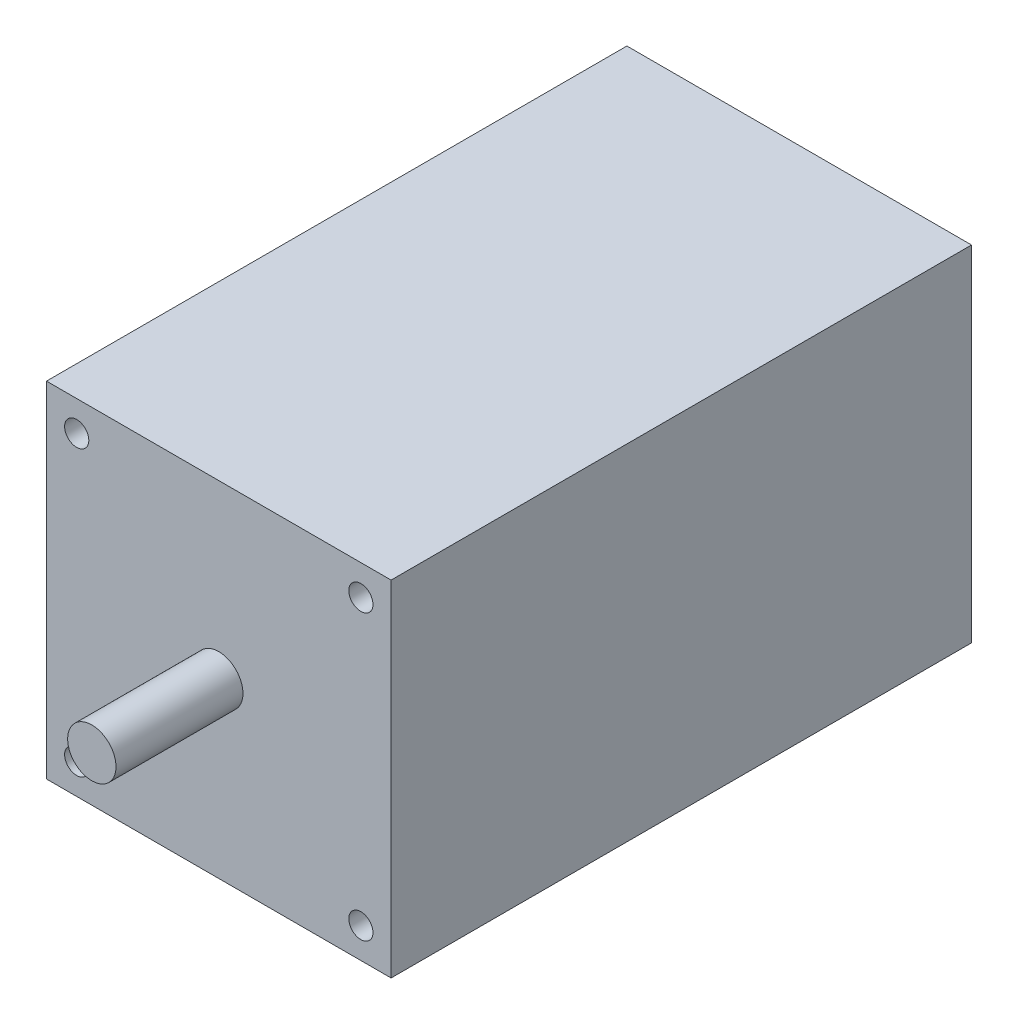
ISO-10303-21;
HEADER;
FILE_DESCRIPTION(('STEP AP214'),'2;1');
FILE_NAME('part.step','',(''),(''),'','','');
FILE_SCHEMA(('AUTOMOTIVE_DESIGN { 1 0 10303 214 1 1 1 1 }'));
ENDSEC;
DATA;
#1=APPLICATION_CONTEXT('core data for automotive mechanical design processes');
#2=APPLICATION_PROTOCOL_DEFINITION('international standard','automotive_design',2000,#1);
#3=PRODUCT_CONTEXT('',#1,'mechanical');
#4=PRODUCT('Part','Part','',(#3));
#5=PRODUCT_RELATED_PRODUCT_CATEGORY('part','',(#4));
#6=PRODUCT_DEFINITION_FORMATION('','',#4);
#7=PRODUCT_DEFINITION_CONTEXT('part definition',#1,'design');
#8=PRODUCT_DEFINITION('design','',#6,#7);
#9=PRODUCT_DEFINITION_SHAPE('','',#8);
#10=(LENGTH_UNIT() NAMED_UNIT(*) SI_UNIT(.MILLI.,.METRE.));
#11=(NAMED_UNIT(*) PLANE_ANGLE_UNIT() SI_UNIT($,.RADIAN.));
#12=(NAMED_UNIT(*) SI_UNIT($,.STERADIAN.) SOLID_ANGLE_UNIT());
#13=UNCERTAINTY_MEASURE_WITH_UNIT(LENGTH_MEASURE(1.E-05),#10,'distance_accuracy_value','');
#14=(GEOMETRIC_REPRESENTATION_CONTEXT(3) GLOBAL_UNCERTAINTY_ASSIGNED_CONTEXT((#13)) GLOBAL_UNIT_ASSIGNED_CONTEXT((#10,
#11,#12)) REPRESENTATION_CONTEXT('',''));
#15=CARTESIAN_POINT('',(0.,0.,0.));
#16=DIRECTION('',(0.,0.,1.));
#17=DIRECTION('',(1.,0.,0.));
#18=AXIS2_PLACEMENT_3D('',#15,#16,#17);
#19=CARTESIAN_POINT('',(-28.5,28.5,-96.));
#20=DIRECTION('',(-1.,0.,0.));
#21=DIRECTION('',(0.,0.,1.));
#22=AXIS2_PLACEMENT_3D('',#19,#20,#21);
#23=PLANE('',#22);
#24=DIRECTION('',(0.,-1.,0.));
#25=VECTOR('',#24,1.);
#26=CARTESIAN_POINT('',(-28.5,28.5,0.));
#27=LINE('',#26,#25);
#28=CARTESIAN_POINT('',(-28.5,28.5,0.));
#29=VERTEX_POINT('',#28);
#30=CARTESIAN_POINT('',(-28.5,-28.5,0.));
#31=VERTEX_POINT('',#30);
#32=EDGE_CURVE('E101',#29,#31,#27,.T.);
#33=ORIENTED_EDGE('',*,*,#32,.F.);
#34=DIRECTION('',(0.,0.,1.));
#35=VECTOR('',#34,1.);
#36=CARTESIAN_POINT('',(-28.5,28.5,-96.));
#37=LINE('',#36,#35);
#38=CARTESIAN_POINT('',(-28.5,28.5,-96.));
#39=VERTEX_POINT('',#38);
#40=EDGE_CURVE('E42',#39,#29,#37,.T.);
#41=ORIENTED_EDGE('',*,*,#40,.F.);
#42=DIRECTION('',(0.,-1.,0.));
#43=VECTOR('',#42,1.);
#44=CARTESIAN_POINT('',(-28.5,28.5,-96.));
#45=LINE('',#44,#43);
#46=CARTESIAN_POINT('',(-28.5,-28.5,-96.));
#47=VERTEX_POINT('',#46);
#48=EDGE_CURVE('E94',#39,#47,#45,.T.);
#49=ORIENTED_EDGE('',*,*,#48,.T.);
#50=DIRECTION('',(0.,0.,1.));
#51=VECTOR('',#50,1.);
#52=CARTESIAN_POINT('',(-28.5,-28.5,-96.));
#53=LINE('',#52,#51);
#54=EDGE_CURVE('E77',#47,#31,#53,.T.);
#55=ORIENTED_EDGE('',*,*,#54,.T.);
#56=EDGE_LOOP('',(#33,#41,#49,#55));
#57=FACE_BOUND('',#56,.T.);
#58=ADVANCED_FACE('F34',(#57),#23,.T.);
#59=CARTESIAN_POINT('',(28.5,28.5,-96.));
#60=DIRECTION('',(0.,1.,0.));
#61=DIRECTION('',(0.,0.,1.));
#62=AXIS2_PLACEMENT_3D('',#59,#60,#61);
#63=PLANE('',#62);
#64=DIRECTION('',(-1.,0.,0.));
#65=VECTOR('',#64,1.);
#66=CARTESIAN_POINT('',(28.5,28.5,0.));
#67=LINE('',#66,#65);
#68=CARTESIAN_POINT('',(28.5,28.5,0.));
#69=VERTEX_POINT('',#68);
#70=EDGE_CURVE('E96',#69,#29,#67,.T.);
#71=ORIENTED_EDGE('',*,*,#70,.F.);
#72=DIRECTION('',(0.,0.,1.));
#73=VECTOR('',#72,1.);
#74=CARTESIAN_POINT('',(28.5,28.5,-96.));
#75=LINE('',#74,#73);
#76=CARTESIAN_POINT('',(28.5,28.5,-96.));
#77=VERTEX_POINT('',#76);
#78=EDGE_CURVE('E66',#77,#69,#75,.T.);
#79=ORIENTED_EDGE('',*,*,#78,.F.);
#80=DIRECTION('',(-1.,0.,0.));
#81=VECTOR('',#80,1.);
#82=CARTESIAN_POINT('',(28.5,28.5,-96.));
#83=LINE('',#82,#81);
#84=EDGE_CURVE('E91',#77,#39,#83,.T.);
#85=ORIENTED_EDGE('',*,*,#84,.T.);
#86=ORIENTED_EDGE('',*,*,#40,.T.);
#87=EDGE_LOOP('',(#71,#79,#85,#86));
#88=FACE_BOUND('',#87,.T.);
#89=ADVANCED_FACE('F113',(#88),#63,.T.);
#90=CARTESIAN_POINT('',(28.5,28.5,-96.));
#91=DIRECTION('',(1.,0.,0.));
#92=DIRECTION('',(0.,0.,-1.));
#93=AXIS2_PLACEMENT_3D('',#90,#91,#92);
#94=PLANE('',#93);
#95=DIRECTION('',(0.,1.,0.));
#96=VECTOR('',#95,1.);
#97=CARTESIAN_POINT('',(28.5,28.5,0.));
#98=LINE('',#97,#96);
#99=CARTESIAN_POINT('',(28.5,-28.5,0.));
#100=VERTEX_POINT('',#99);
#101=EDGE_CURVE('E85',#100,#69,#98,.T.);
#102=ORIENTED_EDGE('',*,*,#101,.F.);
#103=DIRECTION('',(0.,0.,1.));
#104=VECTOR('',#103,1.);
#105=CARTESIAN_POINT('',(28.5,-28.5,-96.));
#106=LINE('',#105,#104);
#107=CARTESIAN_POINT('',(28.5,-28.5,-96.));
#108=VERTEX_POINT('',#107);
#109=EDGE_CURVE('E80',#108,#100,#106,.T.);
#110=ORIENTED_EDGE('',*,*,#109,.F.);
#111=DIRECTION('',(0.,1.,0.));
#112=VECTOR('',#111,1.);
#113=CARTESIAN_POINT('',(28.5,28.5,-96.));
#114=LINE('',#113,#112);
#115=EDGE_CURVE('E83',#108,#77,#114,.T.);
#116=ORIENTED_EDGE('',*,*,#115,.T.);
#117=ORIENTED_EDGE('',*,*,#78,.T.);
#118=EDGE_LOOP('',(#102,#110,#116,#117));
#119=FACE_BOUND('',#118,.T.);
#120=ADVANCED_FACE('F82',(#119),#94,.T.);
#121=CARTESIAN_POINT('',(28.5,-28.5,-96.));
#122=DIRECTION('',(0.,-1.,0.));
#123=DIRECTION('',(0.,0.,-1.));
#124=AXIS2_PLACEMENT_3D('',#121,#122,#123);
#125=PLANE('',#124);
#126=DIRECTION('',(1.,0.,0.));
#127=VECTOR('',#126,1.);
#128=CARTESIAN_POINT('',(28.5,-28.5,0.));
#129=LINE('',#128,#127);
#130=EDGE_CURVE('E104',#31,#100,#129,.T.);
#131=ORIENTED_EDGE('',*,*,#130,.F.);
#132=ORIENTED_EDGE('',*,*,#54,.F.);
#133=DIRECTION('',(1.,0.,0.));
#134=VECTOR('',#133,1.);
#135=CARTESIAN_POINT('',(28.5,-28.5,-96.));
#136=LINE('',#135,#134);
#137=EDGE_CURVE('E90',#47,#108,#136,.T.);
#138=ORIENTED_EDGE('',*,*,#137,.T.);
#139=ORIENTED_EDGE('',*,*,#109,.T.);
#140=EDGE_LOOP('',(#131,#132,#138,#139));
#141=FACE_BOUND('',#140,.T.);
#142=ADVANCED_FACE('F93',(#141),#125,.T.);
#143=CARTESIAN_POINT('',(0.,0.,-96.));
#144=DIRECTION('',(0.,0.,-1.));
#145=DIRECTION('',(-1.,0.,0.));
#146=AXIS2_PLACEMENT_3D('',#143,#144,#145);
#147=PLANE('',#146);
#148=CARTESIAN_POINT('',(-23.5,-23.5,-96.));
#149=DIRECTION('',(0.,0.,1.));
#150=DIRECTION('',(-1.,0.,0.));
#151=AXIS2_PLACEMENT_3D('',#148,#149,#150);
#152=CIRCLE('',#151,2.);
#153=CARTESIAN_POINT('',(-25.5,-23.5,-96.));
#154=VERTEX_POINT('',#153);
#155=EDGE_CURVE('E166',#154,#154,#152,.T.);
#156=ORIENTED_EDGE('',*,*,#155,.T.);
#157=EDGE_LOOP('',(#156));
#158=FACE_BOUND('',#157,.T.);
#159=CARTESIAN_POINT('',(23.5,-23.5,-96.));
#160=DIRECTION('',(0.,0.,1.));
#161=DIRECTION('',(-1.,0.,0.));
#162=AXIS2_PLACEMENT_3D('',#159,#160,#161);
#163=CIRCLE('',#162,2.);
#164=CARTESIAN_POINT('',(21.5,-23.5,-96.));
#165=VERTEX_POINT('',#164);
#166=EDGE_CURVE('E171',#165,#165,#163,.T.);
#167=ORIENTED_EDGE('',*,*,#166,.T.);
#168=EDGE_LOOP('',(#167));
#169=FACE_BOUND('',#168,.T.);
#170=CARTESIAN_POINT('',(23.5,23.5,-96.));
#171=DIRECTION('',(0.,0.,1.));
#172=DIRECTION('',(1.,0.,0.));
#173=AXIS2_PLACEMENT_3D('',#170,#171,#172);
#174=CIRCLE('',#173,2.);
#175=CARTESIAN_POINT('',(25.5,23.5,-96.));
#176=VERTEX_POINT('',#175);
#177=EDGE_CURVE('E177',#176,#176,#174,.T.);
#178=ORIENTED_EDGE('',*,*,#177,.T.);
#179=EDGE_LOOP('',(#178));
#180=FACE_BOUND('',#179,.T.);
#181=CARTESIAN_POINT('',(-23.5,23.5,-96.));
#182=DIRECTION('',(0.,0.,1.));
#183=DIRECTION('',(1.,0.,0.));
#184=AXIS2_PLACEMENT_3D('',#181,#182,#183);
#185=CIRCLE('',#184,2.);
#186=CARTESIAN_POINT('',(-21.5,23.5,-96.));
#187=VERTEX_POINT('',#186);
#188=EDGE_CURVE('E105',#187,#187,#185,.T.);
#189=ORIENTED_EDGE('',*,*,#188,.T.);
#190=EDGE_LOOP('',(#189));
#191=FACE_BOUND('',#190,.T.);
#192=ORIENTED_EDGE('',*,*,#48,.F.);
#193=ORIENTED_EDGE('',*,*,#84,.F.);
#194=ORIENTED_EDGE('',*,*,#115,.F.);
#195=ORIENTED_EDGE('',*,*,#137,.F.);
#196=EDGE_LOOP('',(#192,#193,#194,#195));
#197=FACE_BOUND('',#196,.T.);
#198=ADVANCED_FACE('F89',(#158,#169,#180,#191,#197),#147,.T.);
#199=CARTESIAN_POINT('',(0.,0.,0.));
#200=DIRECTION('',(0.,0.,-1.));
#201=DIRECTION('',(-1.,0.,0.));
#202=AXIS2_PLACEMENT_3D('',#199,#200,#201);
#203=PLANE('',#202);
#204=CARTESIAN_POINT('',(0.,0.,0.));
#205=DIRECTION('',(0.,0.,-1.));
#206=DIRECTION('',(-1.,0.,0.));
#207=AXIS2_PLACEMENT_3D('',#204,#205,#206);
#208=CIRCLE('',#207,4.);
#209=CARTESIAN_POINT('',(-4.,0.,0.));
#210=VERTEX_POINT('',#209);
#211=EDGE_CURVE('E11',#210,#210,#208,.F.);
#212=ORIENTED_EDGE('',*,*,#211,.F.);
#213=EDGE_LOOP('',(#212));
#214=FACE_BOUND('',#213,.T.);
#215=CARTESIAN_POINT('',(-23.5,-23.5,0.));
#216=DIRECTION('',(0.,0.,1.));
#217=DIRECTION('',(-1.,0.,0.));
#218=AXIS2_PLACEMENT_3D('',#215,#216,#217);
#219=CIRCLE('',#218,2.);
#220=CARTESIAN_POINT('',(-25.5,-23.5,0.));
#221=VERTEX_POINT('',#220);
#222=EDGE_CURVE('E163',#221,#221,#219,.T.);
#223=ORIENTED_EDGE('',*,*,#222,.F.);
#224=EDGE_LOOP('',(#223));
#225=FACE_BOUND('',#224,.T.);
#226=CARTESIAN_POINT('',(23.5,-23.5,0.));
#227=DIRECTION('',(0.,0.,1.));
#228=DIRECTION('',(-1.,0.,0.));
#229=AXIS2_PLACEMENT_3D('',#226,#227,#228);
#230=CIRCLE('',#229,2.);
#231=CARTESIAN_POINT('',(21.5,-23.5,0.));
#232=VERTEX_POINT('',#231);
#233=EDGE_CURVE('E169',#232,#232,#230,.T.);
#234=ORIENTED_EDGE('',*,*,#233,.F.);
#235=EDGE_LOOP('',(#234));
#236=FACE_BOUND('',#235,.T.);
#237=CARTESIAN_POINT('',(23.5,23.5,0.));
#238=DIRECTION('',(0.,0.,1.));
#239=DIRECTION('',(1.,0.,0.));
#240=AXIS2_PLACEMENT_3D('',#237,#238,#239);
#241=CIRCLE('',#240,2.);
#242=CARTESIAN_POINT('',(25.5,23.5,0.));
#243=VERTEX_POINT('',#242);
#244=EDGE_CURVE('E174',#243,#243,#241,.T.);
#245=ORIENTED_EDGE('',*,*,#244,.F.);
#246=EDGE_LOOP('',(#245));
#247=FACE_BOUND('',#246,.T.);
#248=CARTESIAN_POINT('',(-23.5,23.5,0.));
#249=DIRECTION('',(0.,0.,1.));
#250=DIRECTION('',(1.,0.,0.));
#251=AXIS2_PLACEMENT_3D('',#248,#249,#250);
#252=CIRCLE('',#251,2.);
#253=CARTESIAN_POINT('',(-21.5,23.5,0.));
#254=VERTEX_POINT('',#253);
#255=EDGE_CURVE('E180',#254,#254,#252,.T.);
#256=ORIENTED_EDGE('',*,*,#255,.F.);
#257=EDGE_LOOP('',(#256));
#258=FACE_BOUND('',#257,.T.);
#259=ORIENTED_EDGE('',*,*,#32,.T.);
#260=ORIENTED_EDGE('',*,*,#130,.T.);
#261=ORIENTED_EDGE('',*,*,#101,.T.);
#262=ORIENTED_EDGE('',*,*,#70,.T.);
#263=EDGE_LOOP('',(#259,#260,#261,#262));
#264=FACE_BOUND('',#263,.T.);
#265=ADVANCED_FACE('F112',(#214,#225,#236,#247,#258,#264),#203,.F.);
#266=CARTESIAN_POINT('',(-23.5,23.5,-96.));
#267=DIRECTION('',(0.,0.,1.));
#268=DIRECTION('',(1.,0.,0.));
#269=AXIS2_PLACEMENT_3D('',#266,#267,#268);
#270=CYLINDRICAL_SURFACE('',#269,2.);
#271=ORIENTED_EDGE('',*,*,#188,.F.);
#272=EDGE_LOOP('',(#271));
#273=FACE_BOUND('',#272,.T.);
#274=ORIENTED_EDGE('',*,*,#255,.T.);
#275=EDGE_LOOP('',(#274));
#276=FACE_BOUND('',#275,.T.);
#277=ADVANCED_FACE('F131',(#273,#276),#270,.F.);
#278=CARTESIAN_POINT('',(23.5,23.5,-96.));
#279=DIRECTION('',(0.,0.,1.));
#280=DIRECTION('',(1.,0.,0.));
#281=AXIS2_PLACEMENT_3D('',#278,#279,#280);
#282=CYLINDRICAL_SURFACE('',#281,2.);
#283=ORIENTED_EDGE('',*,*,#177,.F.);
#284=EDGE_LOOP('',(#283));
#285=FACE_BOUND('',#284,.T.);
#286=ORIENTED_EDGE('',*,*,#244,.T.);
#287=EDGE_LOOP('',(#286));
#288=FACE_BOUND('',#287,.T.);
#289=ADVANCED_FACE('F138',(#285,#288),#282,.F.);
#290=CARTESIAN_POINT('',(23.5,-23.5,-96.));
#291=DIRECTION('',(0.,0.,1.));
#292=DIRECTION('',(1.,0.,0.));
#293=AXIS2_PLACEMENT_3D('',#290,#291,#292);
#294=CYLINDRICAL_SURFACE('',#293,2.);
#295=ORIENTED_EDGE('',*,*,#166,.F.);
#296=EDGE_LOOP('',(#295));
#297=FACE_BOUND('',#296,.T.);
#298=ORIENTED_EDGE('',*,*,#233,.T.);
#299=EDGE_LOOP('',(#298));
#300=FACE_BOUND('',#299,.T.);
#301=ADVANCED_FACE('F142',(#297,#300),#294,.F.);
#302=CARTESIAN_POINT('',(-23.5,-23.5,-96.));
#303=DIRECTION('',(0.,0.,1.));
#304=DIRECTION('',(1.,0.,0.));
#305=AXIS2_PLACEMENT_3D('',#302,#303,#304);
#306=CYLINDRICAL_SURFACE('',#305,2.);
#307=ORIENTED_EDGE('',*,*,#155,.F.);
#308=EDGE_LOOP('',(#307));
#309=FACE_BOUND('',#308,.T.);
#310=ORIENTED_EDGE('',*,*,#222,.T.);
#311=EDGE_LOOP('',(#310));
#312=FACE_BOUND('',#311,.T.);
#313=ADVANCED_FACE('F146',(#309,#312),#306,.F.);
#314=CARTESIAN_POINT('',(0.,0.,21.));
#315=DIRECTION('',(0.,0.,-1.));
#316=DIRECTION('',(-1.,0.,0.));
#317=AXIS2_PLACEMENT_3D('',#314,#315,#316);
#318=CYLINDRICAL_SURFACE('',#317,4.);
#319=CARTESIAN_POINT('',(0.,0.,21.));
#320=DIRECTION('',(0.,0.,1.));
#321=DIRECTION('',(1.,0.,0.));
#322=AXIS2_PLACEMENT_3D('',#319,#320,#321);
#323=CIRCLE('',#322,4.);
#324=CARTESIAN_POINT('',(-4.,0.,21.));
#325=VERTEX_POINT('',#324);
#326=EDGE_CURVE('E162',#325,#325,#323,.T.);
#327=CARTESIAN_POINT('',(-4.,0.,21.));
#328=CARTESIAN_POINT('',(-4.,0.,20.78125));
#329=CARTESIAN_POINT('',(-4.,0.,20.5625));
#330=CARTESIAN_POINT('',(-4.,0.,20.125));
#331=CARTESIAN_POINT('',(-4.,0.,19.90625));
#332=CARTESIAN_POINT('',(-4.,0.,19.46875));
#333=CARTESIAN_POINT('',(-4.,0.,19.25));
#334=CARTESIAN_POINT('',(-4.,0.,18.8125));
#335=CARTESIAN_POINT('',(-4.,0.,18.59375));
#336=CARTESIAN_POINT('',(-4.,0.,18.15625));
#337=CARTESIAN_POINT('',(-4.,0.,17.9375));
#338=CARTESIAN_POINT('',(-4.,0.,17.5));
#339=CARTESIAN_POINT('',(-4.,0.,17.28125));
#340=CARTESIAN_POINT('',(-4.,0.,16.84375));
#341=CARTESIAN_POINT('',(-4.,0.,16.625));
#342=CARTESIAN_POINT('',(-4.,0.,16.1875));
#343=CARTESIAN_POINT('',(-4.,0.,15.96875));
#344=CARTESIAN_POINT('',(-4.,0.,15.53125));
#345=CARTESIAN_POINT('',(-4.,0.,15.3125));
#346=CARTESIAN_POINT('',(-4.,0.,14.875));
#347=CARTESIAN_POINT('',(-4.,0.,14.65625));
#348=CARTESIAN_POINT('',(-4.,0.,14.21875));
#349=CARTESIAN_POINT('',(-4.,0.,14.));
#350=CARTESIAN_POINT('',(-4.,0.,13.5625));
#351=CARTESIAN_POINT('',(-4.,0.,13.34375));
#352=CARTESIAN_POINT('',(-4.,0.,12.90625));
#353=CARTESIAN_POINT('',(-4.,0.,12.6875));
#354=CARTESIAN_POINT('',(-4.,0.,12.25));
#355=CARTESIAN_POINT('',(-4.,0.,12.03125));
#356=CARTESIAN_POINT('',(-4.,0.,11.59375));
#357=CARTESIAN_POINT('',(-4.,0.,11.375));
#358=CARTESIAN_POINT('',(-4.,0.,10.9375));
#359=CARTESIAN_POINT('',(-4.,0.,10.71875));
#360=CARTESIAN_POINT('',(-4.,0.,10.28125));
#361=CARTESIAN_POINT('',(-4.,0.,10.0625));
#362=CARTESIAN_POINT('',(-4.,0.,9.625));
#363=CARTESIAN_POINT('',(-4.,0.,9.40625));
#364=CARTESIAN_POINT('',(-4.,0.,8.96875));
#365=CARTESIAN_POINT('',(-4.,0.,8.75));
#366=CARTESIAN_POINT('',(-4.,0.,8.3125));
#367=CARTESIAN_POINT('',(-4.,0.,8.09375));
#368=CARTESIAN_POINT('',(-4.,0.,7.65625));
#369=CARTESIAN_POINT('',(-4.,0.,7.4375));
#370=CARTESIAN_POINT('',(-4.,0.,7.));
#371=CARTESIAN_POINT('',(-4.,0.,6.78125));
#372=CARTESIAN_POINT('',(-4.,0.,6.34375));
#373=CARTESIAN_POINT('',(-4.,0.,6.125));
#374=CARTESIAN_POINT('',(-4.,0.,5.6875));
#375=CARTESIAN_POINT('',(-4.,0.,5.46875));
#376=CARTESIAN_POINT('',(-4.,0.,5.03125));
#377=CARTESIAN_POINT('',(-4.,0.,4.8125));
#378=CARTESIAN_POINT('',(-4.,0.,4.375));
#379=CARTESIAN_POINT('',(-4.,0.,4.15625));
#380=CARTESIAN_POINT('',(-4.,0.,3.71875));
#381=CARTESIAN_POINT('',(-4.,0.,3.5));
#382=CARTESIAN_POINT('',(-4.,0.,3.0625));
#383=CARTESIAN_POINT('',(-4.,0.,2.84375));
#384=CARTESIAN_POINT('',(-4.,0.,2.40625));
#385=CARTESIAN_POINT('',(-4.,0.,2.1875));
#386=CARTESIAN_POINT('',(-4.,0.,1.75));
#387=CARTESIAN_POINT('',(-4.,0.,1.53125));
#388=CARTESIAN_POINT('',(-4.,0.,1.09375));
#389=CARTESIAN_POINT('',(-4.,0.,0.875000000000001));
#390=CARTESIAN_POINT('',(-4.,0.,0.4375));
#391=CARTESIAN_POINT('',(-4.,0.,0.21875));
#392=CARTESIAN_POINT('',(-4.,0.,0.));
#393=B_SPLINE_CURVE_WITH_KNOTS('',3,(#327,#328,#329,#330,#331,#332,#333,#334,#335,#336,#337,
#338,#339,#340,#341,#342,#343,#344,#345,#346,#347,#348,#349,#350,#351,#352,#353,#354,#355,#356,
#357,#358,#359,#360,#361,#362,#363,#364,#365,#366,#367,#368,#369,#370,#371,#372,#373,#374,#375,
#376,#377,#378,#379,#380,#381,#382,#383,#384,#385,#386,#387,#388,#389,#390,#391,#392),
.UNSPECIFIED.,.F.,.F.,(4,2,2,2,2,2,2,2,2,2,2,2,2,2,2,2,2,2,2,2,2,2,2,2,2,2,2,2,2,2,2,2,4),(0.,
0.656249999999997,1.3125,1.96875,2.625,3.28125,3.9375,4.59375,5.25,5.90625,6.5625,7.21875,7.875,
8.53125,9.1875,9.84375,10.5,11.15625,11.8125,12.46875,13.125,13.78125,14.4375,15.09375,15.75,
16.40625,17.0625,17.71875,18.375,19.03125,19.6875,20.34375,21.),.UNSPECIFIED.);
#394=EDGE_CURVE('BSEAM150',#325,#210,#393,.T.);
#395=ORIENTED_EDGE('',*,*,#326,.F.);
#396=ORIENTED_EDGE('',*,*,#211,.T.);
#397=ORIENTED_EDGE('',*,*,#394,.T.);
#398=ORIENTED_EDGE('',*,*,#394,.F.);
#399=EDGE_LOOP('',(#395,#397,#396,#398));
#400=FACE_BOUND('',#399,.T.);
#401=ADVANCED_FACE('F150',(#400),#318,.T.);
#402=CARTESIAN_POINT('',(0.,0.,21.));
#403=DIRECTION('',(0.,0.,1.));
#404=DIRECTION('',(1.,0.,0.));
#405=AXIS2_PLACEMENT_3D('',#402,#403,#404);
#406=PLANE('',#405);
#407=ORIENTED_EDGE('',*,*,#326,.T.);
#408=EDGE_LOOP('',(#407));
#409=FACE_BOUND('',#408,.T.);
#410=ADVANCED_FACE('F154',(#409),#406,.T.);
#411=CLOSED_SHELL('',(#58,#89,#120,#142,#198,#265,#277,#289,#301,#313,#401,#410));
#412=MANIFOLD_SOLID_BREP('B2',#411);
#413=ADVANCED_BREP_SHAPE_REPRESENTATION('',(#18,#412),#14);
#414=SHAPE_DEFINITION_REPRESENTATION(#9,#413);
ENDSEC;
END-ISO-10303-21;
